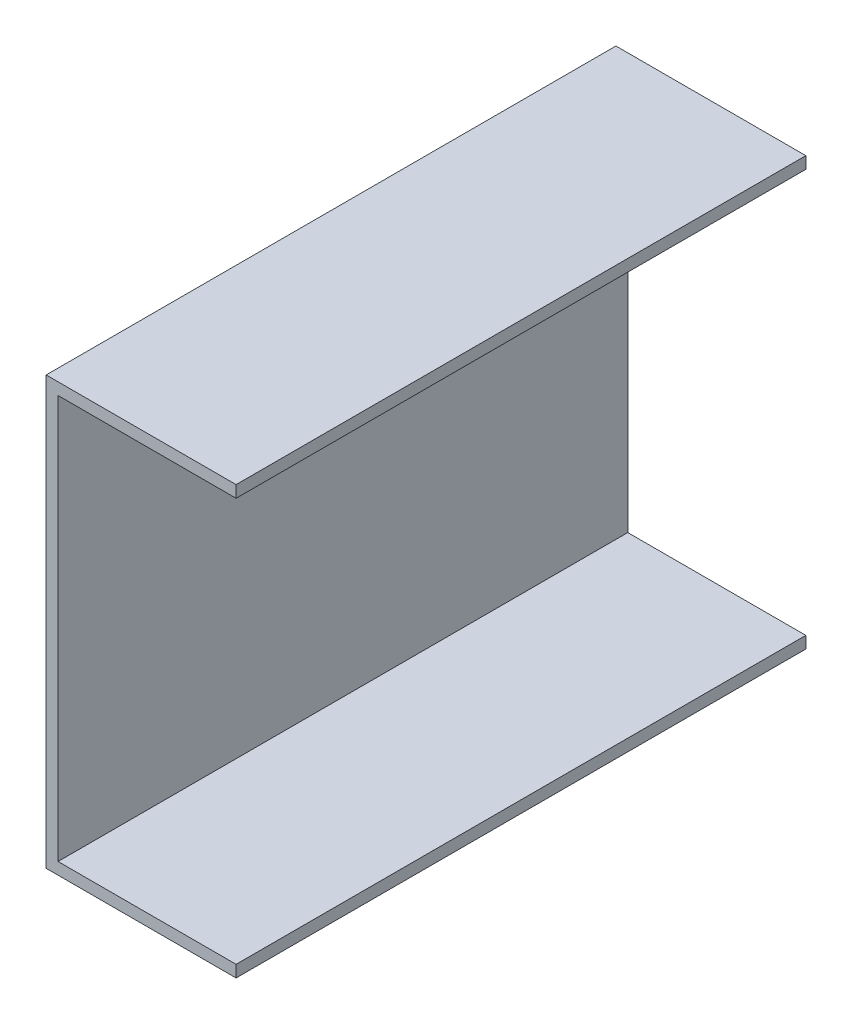
ISO-10303-21;
HEADER;
FILE_DESCRIPTION(('STEP AP214'),'2;1');
FILE_NAME('part.step','',(''),(''),'','','');
FILE_SCHEMA(('AUTOMOTIVE_DESIGN { 1 0 10303 214 1 1 1 1 }'));
ENDSEC;
DATA;
#1=APPLICATION_CONTEXT('core data for automotive mechanical design processes');
#2=APPLICATION_PROTOCOL_DEFINITION('international standard','automotive_design',2000,#1);
#3=PRODUCT_CONTEXT('',#1,'mechanical');
#4=PRODUCT('Part','Part','',(#3));
#5=PRODUCT_RELATED_PRODUCT_CATEGORY('part','',(#4));
#6=PRODUCT_DEFINITION_FORMATION('','',#4);
#7=PRODUCT_DEFINITION_CONTEXT('part definition',#1,'design');
#8=PRODUCT_DEFINITION('design','',#6,#7);
#9=PRODUCT_DEFINITION_SHAPE('','',#8);
#10=(LENGTH_UNIT() NAMED_UNIT(*) SI_UNIT(.MILLI.,.METRE.));
#11=(NAMED_UNIT(*) PLANE_ANGLE_UNIT() SI_UNIT($,.RADIAN.));
#12=(NAMED_UNIT(*) SI_UNIT($,.STERADIAN.) SOLID_ANGLE_UNIT());
#13=UNCERTAINTY_MEASURE_WITH_UNIT(LENGTH_MEASURE(1.E-05),#10,'distance_accuracy_value','');
#14=(GEOMETRIC_REPRESENTATION_CONTEXT(3) GLOBAL_UNCERTAINTY_ASSIGNED_CONTEXT((#13)) GLOBAL_UNIT_ASSIGNED_CONTEXT((#10,
#11,#12)) REPRESENTATION_CONTEXT('',''));
#15=CARTESIAN_POINT('',(0.,0.,0.));
#16=DIRECTION('',(0.,0.,1.));
#17=DIRECTION('',(1.,0.,0.));
#18=AXIS2_PLACEMENT_3D('',#15,#16,#17);
#19=CARTESIAN_POINT('',(-25.4,-57.15,76.2));
#20=DIRECTION('',(0.,1.,0.));
#21=DIRECTION('',(0.,0.,1.));
#22=AXIS2_PLACEMENT_3D('',#19,#20,#21);
#23=PLANE('',#22);
#24=DIRECTION('',(1.,0.,0.));
#25=VECTOR('',#24,1.);
#26=CARTESIAN_POINT('',(-25.4,-57.15,0.));
#27=LINE('',#26,#25);
#28=CARTESIAN_POINT('',(-25.4,-57.15,0.));
#29=VERTEX_POINT('',#28);
#30=CARTESIAN_POINT('',(0.,-57.15,0.));
#31=VERTEX_POINT('',#30);
#32=EDGE_CURVE('E160',#29,#31,#27,.T.);
#33=ORIENTED_EDGE('',*,*,#32,.T.);
#34=DIRECTION('',(0.,0.,-1.));
#35=VECTOR('',#34,1.);
#36=CARTESIAN_POINT('',(0.,-57.15,76.2));
#37=LINE('',#36,#35);
#38=CARTESIAN_POINT('',(0.,-57.15,76.2));
#39=VERTEX_POINT('',#38);
#40=EDGE_CURVE('E11',#39,#31,#37,.T.);
#41=ORIENTED_EDGE('',*,*,#40,.F.);
#42=DIRECTION('',(1.,0.,0.));
#43=VECTOR('',#42,1.);
#44=CARTESIAN_POINT('',(-25.4,-57.15,76.2));
#45=LINE('',#44,#43);
#46=CARTESIAN_POINT('',(-25.4,-57.15,76.2));
#47=VERTEX_POINT('',#46);
#48=EDGE_CURVE('E111',#47,#39,#45,.T.);
#49=ORIENTED_EDGE('',*,*,#48,.F.);
#50=DIRECTION('',(0.,0.,-1.));
#51=VECTOR('',#50,1.);
#52=CARTESIAN_POINT('',(-25.4,-57.15,76.2));
#53=LINE('',#52,#51);
#54=EDGE_CURVE('E159',#47,#29,#53,.T.);
#55=ORIENTED_EDGE('',*,*,#54,.T.);
#56=EDGE_LOOP('',(#33,#41,#49,#55));
#57=FACE_BOUND('',#56,.T.);
#58=ADVANCED_FACE('F41',(#57),#23,.F.);
#59=CARTESIAN_POINT('',(0.,-55.5625,76.2));
#60=DIRECTION('',(1.,0.,0.));
#61=DIRECTION('',(0.,0.,-1.));
#62=AXIS2_PLACEMENT_3D('',#59,#60,#61);
#63=PLANE('',#62);
#64=DIRECTION('',(0.,-1.,0.));
#65=VECTOR('',#64,1.);
#66=CARTESIAN_POINT('',(0.,-55.5625,0.));
#67=LINE('',#66,#65);
#68=CARTESIAN_POINT('',(0.,-55.5625,0.));
#69=VERTEX_POINT('',#68);
#70=EDGE_CURVE('E164',#69,#31,#67,.T.);
#71=ORIENTED_EDGE('',*,*,#70,.F.);
#72=DIRECTION('',(0.,0.,-1.));
#73=VECTOR('',#72,1.);
#74=CARTESIAN_POINT('',(0.,-55.5625,76.2));
#75=LINE('',#74,#73);
#76=CARTESIAN_POINT('',(0.,-55.5625,76.2));
#77=VERTEX_POINT('',#76);
#78=EDGE_CURVE('E50',#77,#69,#75,.T.);
#79=ORIENTED_EDGE('',*,*,#78,.F.);
#80=DIRECTION('',(0.,-1.,0.));
#81=VECTOR('',#80,1.);
#82=CARTESIAN_POINT('',(0.,-55.5625,76.2));
#83=LINE('',#82,#81);
#84=EDGE_CURVE('E216',#77,#39,#83,.T.);
#85=ORIENTED_EDGE('',*,*,#84,.T.);
#86=ORIENTED_EDGE('',*,*,#40,.T.);
#87=EDGE_LOOP('',(#71,#79,#85,#86));
#88=FACE_BOUND('',#87,.T.);
#89=ADVANCED_FACE('F207',(#88),#63,.T.);
#90=CARTESIAN_POINT('',(-25.4,-55.5625,76.2));
#91=DIRECTION('',(0.,1.,0.));
#92=DIRECTION('',(0.,0.,1.));
#93=AXIS2_PLACEMENT_3D('',#90,#91,#92);
#94=PLANE('',#93);
#95=DIRECTION('',(1.,0.,0.));
#96=VECTOR('',#95,1.);
#97=CARTESIAN_POINT('',(-25.4,-55.5625,0.));
#98=LINE('',#97,#96);
#99=CARTESIAN_POINT('',(-23.8125,-55.5625,0.));
#100=VERTEX_POINT('',#99);
#101=EDGE_CURVE('E168',#100,#69,#98,.T.);
#102=ORIENTED_EDGE('',*,*,#101,.F.);
#103=DIRECTION('',(0.,0.,-1.));
#104=VECTOR('',#103,1.);
#105=CARTESIAN_POINT('',(-23.8125,-55.5625,76.2));
#106=LINE('',#105,#104);
#107=CARTESIAN_POINT('',(-23.8125,-55.5625,76.2));
#108=VERTEX_POINT('',#107);
#109=EDGE_CURVE('E195',#108,#100,#106,.T.);
#110=ORIENTED_EDGE('',*,*,#109,.F.);
#111=DIRECTION('',(1.,0.,0.));
#112=VECTOR('',#111,1.);
#113=CARTESIAN_POINT('',(-25.4,-55.5625,76.2));
#114=LINE('',#113,#112);
#115=EDGE_CURVE('E204',#108,#77,#114,.T.);
#116=ORIENTED_EDGE('',*,*,#115,.T.);
#117=ORIENTED_EDGE('',*,*,#78,.T.);
#118=EDGE_LOOP('',(#102,#110,#116,#117));
#119=FACE_BOUND('',#118,.T.);
#120=ADVANCED_FACE('F202',(#119),#94,.T.);
#121=CARTESIAN_POINT('',(-23.8125,0.,76.2));
#122=DIRECTION('',(1.,0.,0.));
#123=DIRECTION('',(0.,1.,0.));
#124=AXIS2_PLACEMENT_3D('',#121,#122,#123);
#125=PLANE('',#124);
#126=DIRECTION('',(0.,-1.,0.));
#127=VECTOR('',#126,1.);
#128=CARTESIAN_POINT('',(-23.8125,0.,0.));
#129=LINE('',#128,#127);
#130=CARTESIAN_POINT('',(-23.8125,-1.5875,0.));
#131=VERTEX_POINT('',#130);
#132=EDGE_CURVE('E172',#131,#100,#129,.T.);
#133=ORIENTED_EDGE('',*,*,#132,.F.);
#134=DIRECTION('',(0.,0.,-1.));
#135=VECTOR('',#134,1.);
#136=CARTESIAN_POINT('',(-23.8125,-1.5875,76.2));
#137=LINE('',#136,#135);
#138=CARTESIAN_POINT('',(-23.8125,-1.5875,76.2));
#139=VERTEX_POINT('',#138);
#140=EDGE_CURVE('E192',#139,#131,#137,.T.);
#141=ORIENTED_EDGE('',*,*,#140,.F.);
#142=DIRECTION('',(0.,-1.,0.));
#143=VECTOR('',#142,1.);
#144=CARTESIAN_POINT('',(-23.8125,0.,76.2));
#145=LINE('',#144,#143);
#146=EDGE_CURVE('E153',#139,#108,#145,.T.);
#147=ORIENTED_EDGE('',*,*,#146,.T.);
#148=ORIENTED_EDGE('',*,*,#109,.T.);
#149=EDGE_LOOP('',(#133,#141,#147,#148));
#150=FACE_BOUND('',#149,.T.);
#151=ADVANCED_FACE('F214',(#150),#125,.T.);
#152=CARTESIAN_POINT('',(0.,-1.5875,76.2));
#153=DIRECTION('',(0.,-1.,0.));
#154=DIRECTION('',(1.,0.,0.));
#155=AXIS2_PLACEMENT_3D('',#152,#153,#154);
#156=PLANE('',#155);
#157=DIRECTION('',(-1.,0.,0.));
#158=VECTOR('',#157,1.);
#159=CARTESIAN_POINT('',(0.,-1.5875,0.));
#160=LINE('',#159,#158);
#161=CARTESIAN_POINT('',(0.,-1.5875,0.));
#162=VERTEX_POINT('',#161);
#163=EDGE_CURVE('E176',#162,#131,#160,.T.);
#164=ORIENTED_EDGE('',*,*,#163,.F.);
#165=DIRECTION('',(0.,0.,-1.));
#166=VECTOR('',#165,1.);
#167=CARTESIAN_POINT('',(0.,-1.5875,76.2));
#168=LINE('',#167,#166);
#169=CARTESIAN_POINT('',(0.,-1.5875,76.2));
#170=VERTEX_POINT('',#169);
#171=EDGE_CURVE('E138',#170,#162,#168,.T.);
#172=ORIENTED_EDGE('',*,*,#171,.F.);
#173=DIRECTION('',(-1.,0.,0.));
#174=VECTOR('',#173,1.);
#175=CARTESIAN_POINT('',(0.,-1.5875,76.2));
#176=LINE('',#175,#174);
#177=EDGE_CURVE('E149',#170,#139,#176,.T.);
#178=ORIENTED_EDGE('',*,*,#177,.T.);
#179=ORIENTED_EDGE('',*,*,#140,.T.);
#180=EDGE_LOOP('',(#164,#172,#178,#179));
#181=FACE_BOUND('',#180,.T.);
#182=ADVANCED_FACE('F225',(#181),#156,.T.);
#183=CARTESIAN_POINT('',(0.,0.,76.2));
#184=DIRECTION('',(1.,0.,0.));
#185=DIRECTION('',(0.,1.,0.));
#186=AXIS2_PLACEMENT_3D('',#183,#184,#185);
#187=PLANE('',#186);
#188=DIRECTION('',(0.,-1.,0.));
#189=VECTOR('',#188,1.);
#190=CARTESIAN_POINT('',(0.,0.,0.));
#191=LINE('',#190,#189);
#192=CARTESIAN_POINT('',(0.,0.,0.));
#193=VERTEX_POINT('',#192);
#194=EDGE_CURVE('E136',#193,#162,#191,.T.);
#195=ORIENTED_EDGE('',*,*,#194,.F.);
#196=DIRECTION('',(0.,0.,-1.));
#197=VECTOR('',#196,1.);
#198=CARTESIAN_POINT('',(0.,0.,76.2));
#199=LINE('',#198,#197);
#200=CARTESIAN_POINT('',(0.,0.,76.2));
#201=VERTEX_POINT('',#200);
#202=EDGE_CURVE('E130',#201,#193,#199,.T.);
#203=ORIENTED_EDGE('',*,*,#202,.F.);
#204=DIRECTION('',(0.,-1.,0.));
#205=VECTOR('',#204,1.);
#206=CARTESIAN_POINT('',(0.,0.,76.2));
#207=LINE('',#206,#205);
#208=EDGE_CURVE('E134',#201,#170,#207,.T.);
#209=ORIENTED_EDGE('',*,*,#208,.T.);
#210=ORIENTED_EDGE('',*,*,#171,.T.);
#211=EDGE_LOOP('',(#195,#203,#209,#210));
#212=FACE_BOUND('',#211,.T.);
#213=ADVANCED_FACE('F132',(#212),#187,.T.);
#214=CARTESIAN_POINT('',(0.,0.,76.2));
#215=DIRECTION('',(0.,-1.,0.));
#216=DIRECTION('',(1.,0.,0.));
#217=AXIS2_PLACEMENT_3D('',#214,#215,#216);
#218=PLANE('',#217);
#219=DIRECTION('',(-1.,0.,0.));
#220=VECTOR('',#219,1.);
#221=CARTESIAN_POINT('',(0.,0.,0.));
#222=LINE('',#221,#220);
#223=CARTESIAN_POINT('',(-25.4,0.,0.));
#224=VERTEX_POINT('',#223);
#225=EDGE_CURVE('E96',#193,#224,#222,.T.);
#226=ORIENTED_EDGE('',*,*,#225,.T.);
#227=DIRECTION('',(0.,0.,-1.));
#228=VECTOR('',#227,1.);
#229=CARTESIAN_POINT('',(-25.4,0.,76.2));
#230=LINE('',#229,#228);
#231=CARTESIAN_POINT('',(-25.4,0.,76.2));
#232=VERTEX_POINT('',#231);
#233=EDGE_CURVE('E139',#232,#224,#230,.T.);
#234=ORIENTED_EDGE('',*,*,#233,.F.);
#235=DIRECTION('',(-1.,0.,0.));
#236=VECTOR('',#235,1.);
#237=CARTESIAN_POINT('',(0.,0.,76.2));
#238=LINE('',#237,#236);
#239=EDGE_CURVE('E141',#201,#232,#238,.T.);
#240=ORIENTED_EDGE('',*,*,#239,.F.);
#241=ORIENTED_EDGE('',*,*,#202,.T.);
#242=EDGE_LOOP('',(#226,#234,#240,#241));
#243=FACE_BOUND('',#242,.T.);
#244=ADVANCED_FACE('F142',(#243),#218,.F.);
#245=CARTESIAN_POINT('',(-25.4,0.,76.2));
#246=DIRECTION('',(1.,0.,0.));
#247=DIRECTION('',(0.,1.,0.));
#248=AXIS2_PLACEMENT_3D('',#245,#246,#247);
#249=PLANE('',#248);
#250=DIRECTION('',(0.,-1.,0.));
#251=VECTOR('',#250,1.);
#252=CARTESIAN_POINT('',(-25.4,0.,0.));
#253=LINE('',#252,#251);
#254=EDGE_CURVE('E104',#224,#29,#253,.T.);
#255=ORIENTED_EDGE('',*,*,#254,.T.);
#256=ORIENTED_EDGE('',*,*,#54,.F.);
#257=DIRECTION('',(0.,-1.,0.));
#258=VECTOR('',#257,1.);
#259=CARTESIAN_POINT('',(-25.4,0.,76.2));
#260=LINE('',#259,#258);
#261=EDGE_CURVE('E61',#232,#47,#260,.T.);
#262=ORIENTED_EDGE('',*,*,#261,.F.);
#263=ORIENTED_EDGE('',*,*,#233,.T.);
#264=EDGE_LOOP('',(#255,#256,#262,#263));
#265=FACE_BOUND('',#264,.T.);
#266=ADVANCED_FACE('F227',(#265),#249,.F.);
#267=CARTESIAN_POINT('',(0.,0.,76.2));
#268=DIRECTION('',(0.,0.,-1.));
#269=DIRECTION('',(-1.,0.,0.));
#270=AXIS2_PLACEMENT_3D('',#267,#268,#269);
#271=PLANE('',#270);
#272=ORIENTED_EDGE('',*,*,#48,.T.);
#273=ORIENTED_EDGE('',*,*,#84,.F.);
#274=ORIENTED_EDGE('',*,*,#115,.F.);
#275=ORIENTED_EDGE('',*,*,#146,.F.);
#276=ORIENTED_EDGE('',*,*,#177,.F.);
#277=ORIENTED_EDGE('',*,*,#208,.F.);
#278=ORIENTED_EDGE('',*,*,#239,.T.);
#279=ORIENTED_EDGE('',*,*,#261,.T.);
#280=EDGE_LOOP('',(#272,#273,#274,#275,#276,#277,#278,#279));
#281=FACE_BOUND('',#280,.T.);
#282=ADVANCED_FACE('F146',(#281),#271,.F.);
#283=CARTESIAN_POINT('',(0.,0.,0.));
#284=DIRECTION('',(0.,0.,-1.));
#285=DIRECTION('',(-1.,0.,0.));
#286=AXIS2_PLACEMENT_3D('',#283,#284,#285);
#287=PLANE('',#286);
#288=ORIENTED_EDGE('',*,*,#32,.F.);
#289=ORIENTED_EDGE('',*,*,#254,.F.);
#290=ORIENTED_EDGE('',*,*,#225,.F.);
#291=ORIENTED_EDGE('',*,*,#194,.T.);
#292=ORIENTED_EDGE('',*,*,#163,.T.);
#293=ORIENTED_EDGE('',*,*,#132,.T.);
#294=ORIENTED_EDGE('',*,*,#101,.T.);
#295=ORIENTED_EDGE('',*,*,#70,.T.);
#296=EDGE_LOOP('',(#288,#289,#290,#291,#292,#293,#294,#295));
#297=FACE_BOUND('',#296,.T.);
#298=ADVANCED_FACE('F210',(#297),#287,.T.);
#299=CLOSED_SHELL('',(#58,#89,#120,#151,#182,#213,#244,#266,#282,#298));
#300=MANIFOLD_SOLID_BREP('B2',#299);
#301=ADVANCED_BREP_SHAPE_REPRESENTATION('',(#18,#300),#14);
#302=SHAPE_DEFINITION_REPRESENTATION(#9,#301);
ENDSEC;
END-ISO-10303-21;
